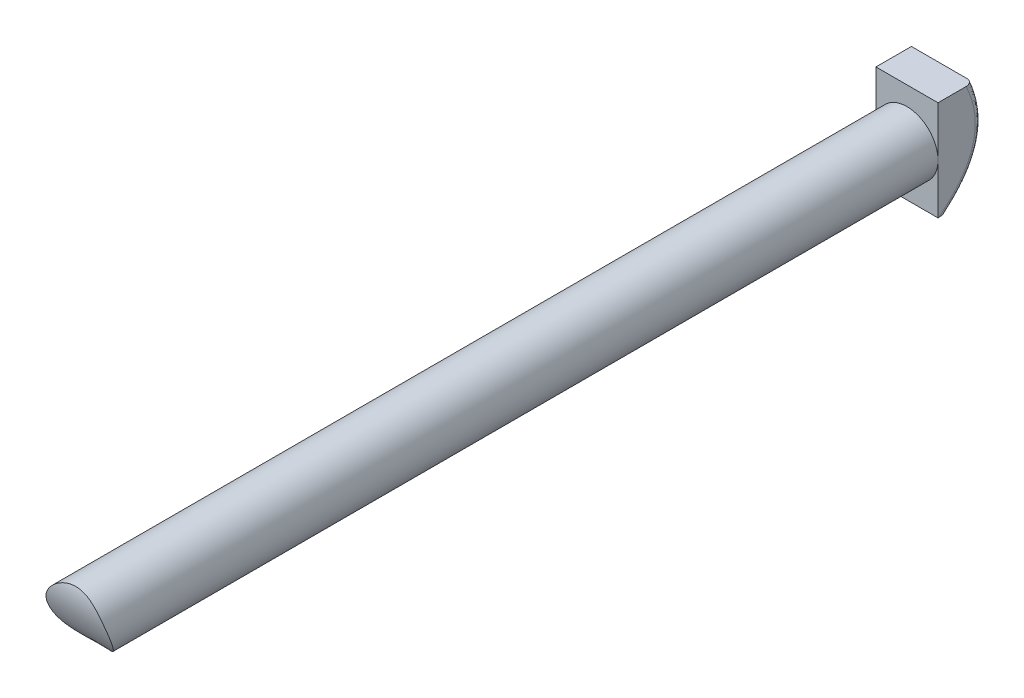
ISO-10303-21;
HEADER;
FILE_DESCRIPTION(('STEP AP214'),'2;1');
FILE_NAME('part.step','',(''),(''),'','','');
FILE_SCHEMA(('AUTOMOTIVE_DESIGN { 1 0 10303 214 1 1 1 1 }'));
ENDSEC;
DATA;
#1=APPLICATION_CONTEXT('core data for automotive mechanical design processes');
#2=APPLICATION_PROTOCOL_DEFINITION('international standard','automotive_design',2000,#1);
#3=PRODUCT_CONTEXT('',#1,'mechanical');
#4=PRODUCT('Part','Part','',(#3));
#5=PRODUCT_RELATED_PRODUCT_CATEGORY('part','',(#4));
#6=PRODUCT_DEFINITION_FORMATION('','',#4);
#7=PRODUCT_DEFINITION_CONTEXT('part definition',#1,'design');
#8=PRODUCT_DEFINITION('design','',#6,#7);
#9=PRODUCT_DEFINITION_SHAPE('','',#8);
#10=(LENGTH_UNIT() NAMED_UNIT(*) SI_UNIT(.MILLI.,.METRE.));
#11=(NAMED_UNIT(*) PLANE_ANGLE_UNIT() SI_UNIT($,.RADIAN.));
#12=(NAMED_UNIT(*) SI_UNIT($,.STERADIAN.) SOLID_ANGLE_UNIT());
#13=UNCERTAINTY_MEASURE_WITH_UNIT(LENGTH_MEASURE(1.E-05),#10,'distance_accuracy_value','');
#14=(GEOMETRIC_REPRESENTATION_CONTEXT(3) GLOBAL_UNCERTAINTY_ASSIGNED_CONTEXT((#13)) GLOBAL_UNIT_ASSIGNED_CONTEXT((#10,
#11,#12)) REPRESENTATION_CONTEXT('',''));
#15=CARTESIAN_POINT('',(0.,0.,0.));
#16=DIRECTION('',(0.,0.,1.));
#17=DIRECTION('',(1.,0.,0.));
#18=AXIS2_PLACEMENT_3D('',#15,#16,#17);
#19=CARTESIAN_POINT('',(0.,0.,76.));
#20=DIRECTION('',(0.,0.,-1.));
#21=DIRECTION('',(-1.,0.,0.));
#22=AXIS2_PLACEMENT_3D('',#19,#20,#21);
#23=CYLINDRICAL_SURFACE('',#22,2.8);
#24=CARTESIAN_POINT('',(-2.8,0.,74.7435755469193));
#25=CARTESIAN_POINT('',(-2.79999762647022,0.138351904805586,74.7976580439721));
#26=CARTESIAN_POINT('',(-2.7897316714088,0.278097777593786,74.8485891226111));
#27=CARTESIAN_POINT('',(-2.75812356861288,0.48759216015189,74.9172705104928));
#28=CARTESIAN_POINT('',(-2.74489030057541,0.557388843720657,74.9388748612339));
#29=CARTESIAN_POINT('',(-2.71291266237373,0.696559649470459,74.9791287525321));
#30=CARTESIAN_POINT('',(-2.69417089401994,0.765933955397322,74.9977796816834));
#31=CARTESIAN_POINT('',(-2.6509752028806,0.904219763511875,75.0319117916057));
#32=CARTESIAN_POINT('',(-2.62648378111979,0.973125033132954,75.0473708546985));
#33=CARTESIAN_POINT('',(-2.57188866284434,1.1094032221047,75.0747504653819));
#34=CARTESIAN_POINT('',(-2.54178503057522,1.17677615898676,75.0866710534749));
#35=CARTESIAN_POINT('',(-2.47609955115154,1.30935222155061,75.1069172374877));
#36=CARTESIAN_POINT('',(-2.44051805665511,1.37455548658483,75.1152430647025));
#37=CARTESIAN_POINT('',(-2.36410741018287,1.50217427538379,75.1284166079698));
#38=CARTESIAN_POINT('',(-2.32327845026488,1.56458990106383,75.1332644512742));
#39=CARTESIAN_POINT('',(-2.24005375821403,1.68133569460541,75.1395078287622));
#40=CARTESIAN_POINT('',(-2.19802742881146,1.73591704180964,75.1411427376584));
#41=CARTESIAN_POINT('',(-2.11005369758693,1.84185279612521,75.1420161470909));
#42=CARTESIAN_POINT('',(-2.06410495150746,1.89320608638997,75.141253822834));
#43=CARTESIAN_POINT('',(-1.92080854936321,2.0419131284115,75.1359423672282));
#44=CARTESIAN_POINT('',(-1.81797129444004,2.13396928055858,75.1283709589539));
#45=CARTESIAN_POINT('',(-1.59353528080983,2.30694282579109,75.1081470974128));
#46=CARTESIAN_POINT('',(-1.47117027617807,2.38682194899047,75.0952098638402));
#47=CARTESIAN_POINT('',(-1.21547699860971,2.52662148741134,75.0686333611557));
#48=CARTESIAN_POINT('',(-1.08214573380327,2.58653643323486,75.054993900841));
#49=CARTESIAN_POINT('',(-0.870660170929278,2.66236680432226,75.0363118377686));
#50=CARTESIAN_POINT('',(-0.795234183980504,2.68586092168323,75.0301947628218));
#51=CARTESIAN_POINT('',(-0.64258263970425,2.72641057810066,75.0193037641352));
#52=CARTESIAN_POINT('',(-0.56535770582049,2.74346831351811,75.0145293823544));
#53=CARTESIAN_POINT('',(-0.409669205803472,2.77099653097655,75.0066859556104));
#54=CARTESIAN_POINT('',(-0.331205790087291,2.78146780674629,75.0036167051683));
#55=CARTESIAN_POINT('',(-0.173623018218384,2.79573112053131,74.9994098513152));
#56=CARTESIAN_POINT('',(-0.094503691771523,2.7995234593898,74.9982721608999));
#57=CARTESIAN_POINT('',(0.0613720108072199,2.80037904200705,74.9980165205912));
#58=CARTESIAN_POINT('',(0.138127265133801,2.79764291065988,74.9988383525225));
#59=CARTESIAN_POINT('',(0.291137606856789,2.78588032031138,75.0023196045069));
#60=CARTESIAN_POINT('',(0.367392511173531,2.77685167571773,75.0049796630325));
#61=CARTESIAN_POINT('',(0.518819643476405,2.75258120819291,75.0119531195065));
#62=CARTESIAN_POINT('',(0.593992047377822,2.73734040685978,75.0162662455985));
#63=CARTESIAN_POINT('',(0.742760164314515,2.70077448064792,75.0262371195217));
#64=CARTESIAN_POINT('',(0.816355293726873,2.67944714403512,75.0318953560159));
#65=CARTESIAN_POINT('',(1.03331773922512,2.60680054142298,75.0502430212239));
#66=CARTESIAN_POINT('',(1.17371391785876,2.54667850747374,75.0643523592354));
#67=CARTESIAN_POINT('',(1.44297499805961,2.40437583716829,75.0922290561966));
#68=CARTESIAN_POINT('',(1.57183432588937,2.3221846145085,75.1059962475512));
#69=CARTESIAN_POINT('',(1.75629627490273,2.18213375220507,75.1228958616605));
#70=CARTESIAN_POINT('',(1.81735251064006,2.1315538853755,75.1279599665008));
#71=CARTESIAN_POINT('',(1.93502147098147,2.02533070645249,75.1359632209438));
#72=CARTESIAN_POINT('',(1.99163624585374,1.96968975657938,75.1389033562205));
#73=CARTESIAN_POINT('',(2.09992595224729,1.85380586665543,75.1419991838089));
#74=CARTESIAN_POINT('',(2.1516050193779,1.79356685682435,75.1421572279462));
#75=CARTESIAN_POINT('',(2.24962618161096,1.66897035107457,75.1391233514823));
#76=CARTESIAN_POINT('',(2.2959688984799,1.60461333632861,75.1359318215968));
#77=CARTESIAN_POINT('',(2.37961824456882,1.47741854045748,75.1261573693158));
#78=CARTESIAN_POINT('',(2.41734331369772,1.41483444698495,75.1198494155563));
#79=CARTESIAN_POINT('',(2.48762681406989,1.28725142244785,75.10381437975));
#80=CARTESIAN_POINT('',(2.52018551743489,1.2222526187931,75.0940874778721));
#81=CARTESIAN_POINT('',(2.57995928906817,1.09043476879734,75.0711765238144));
#82=CARTESIAN_POINT('',(2.6071742768675,1.02361569506283,75.0579924195809));
#83=CARTESIAN_POINT('',(2.65617729823388,0.888746769763792,75.0282851221439));
#84=CARTESIAN_POINT('',(2.67796533211666,0.820696918270864,75.0117619291347));
#85=CARTESIAN_POINT('',(2.7149858122674,0.687976603334097,74.9767047536988));
#86=CARTESIAN_POINT('',(2.73053114514203,0.623345937204844,74.9583488735818));
#87=CARTESIAN_POINT('',(2.75689713989962,0.493851816238371,74.9191989656401));
#88=CARTESIAN_POINT('',(2.76771593283514,0.428988279522988,74.8984039774693));
#89=CARTESIAN_POINT('',(2.79322165754405,0.234511657267058,74.8328728780014));
#90=CARTESIAN_POINT('',(2.80096863232795,0.104973452685037,74.7849800108818));
#91=CARTESIAN_POINT('',(2.79929631210529,-0.0963390504018077,74.7056498371672));
#92=CARTESIAN_POINT('',(2.79583162690781,-0.168971931037816,74.6760050685715));
#93=CARTESIAN_POINT('',(2.78338626293074,-0.313031946274304,74.6149700867135));
#94=CARTESIAN_POINT('',(2.77440547753804,-0.384459057542706,74.583579839726));
#95=CARTESIAN_POINT('',(2.73951523105016,-0.596237222119587,74.4869370810656));
#96=CARTESIAN_POINT('',(2.70565628265857,-0.734200815673466,74.4191672997878));
#97=CARTESIAN_POINT('',(2.61260104803446,-1.01980792380719,74.2680358820652));
#98=CARTESIAN_POINT('',(2.55048695883073,-1.16603914301534,74.1838273262357));
#99=CARTESIAN_POINT('',(2.40405326158826,-1.44404348048602,74.0104774004434));
#100=CARTESIAN_POINT('',(2.31970134234928,-1.57579516230144,73.9213290030604));
#101=CARTESIAN_POINT('',(2.17276981253542,-1.7682170871929,73.7814368054765));
#102=CARTESIAN_POINT('',(2.11704142069412,-1.83456987296545,73.7311309265874));
#103=CARTESIAN_POINT('',(1.99952918271772,-1.961987313066,73.6308079170243));
#104=CARTESIAN_POINT('',(1.937744020425,-2.02305081255907,73.580790851622));
#105=CARTESIAN_POINT('',(1.80827792156313,-2.13955889898021,73.4819586025935));
#106=CARTESIAN_POINT('',(1.74060039291702,-2.19500669419942,73.433142744916));
#107=CARTESIAN_POINT('',(1.59935936177295,-2.29995368811041,73.3377676931295));
#108=CARTESIAN_POINT('',(1.52579838408953,-2.34945541591329,73.2912075446372));
#109=CARTESIAN_POINT('',(1.34420884293528,-2.45930422388734,73.184929474062));
#110=CARTESIAN_POINT('',(1.23352952539254,-2.51684640369195,73.1267510490166));
#111=CARTESIAN_POINT('',(1.00116555867335,-2.61795038361666,73.0214520759772));
#112=CARTESIAN_POINT('',(0.879503679721958,-2.66154029474242,72.9743093454624));
#113=CARTESIAN_POINT('',(0.651351132554299,-2.72521926169455,72.9041235512128));
#114=CARTESIAN_POINT('',(0.546618804535992,-2.748251187277,72.8781581568218));
#115=CARTESIAN_POINT('',(0.386365222193072,-2.77374487083741,72.849187412014));
#116=CARTESIAN_POINT('',(0.332421186055586,-2.78073374571893,72.8411933705098));
#117=CARTESIAN_POINT('',(0.223820338089487,-2.79157236317292,72.8287628132514));
#118=CARTESIAN_POINT('',(0.169163815195323,-2.79542334034496,72.8243248983579));
#119=CARTESIAN_POINT('',(0.0593285816208233,-2.79991322502041,72.819148580433));
#120=CARTESIAN_POINT('',(0.00414866266977717,-2.80053944129147,72.8184247946096));
#121=CARTESIAN_POINT('',(-0.106068473134384,-2.79853301334567,72.8207398916914));
#122=CARTESIAN_POINT('',(-0.161105699250397,-2.79590058625504,72.8237785239033));
#123=CARTESIAN_POINT('',(-0.270628867760436,-2.78743222350126,72.8335151085323));
#124=CARTESIAN_POINT('',(-0.3251145491129,-2.78159483710423,72.8402147180947));
#125=CARTESIAN_POINT('',(-0.433145986585545,-2.76683205366004,72.8570564172083));
#126=CARTESIAN_POINT('',(-0.486691264985054,-2.75790513224644,72.8672002060595));
#127=CARTESIAN_POINT('',(-0.602228983971156,-2.73521330462686,72.8927812040978));
#128=CARTESIAN_POINT('',(-0.66396724570602,-2.72086104465569,72.9088483657738));
#129=CARTESIAN_POINT('',(-0.785307302521116,-2.68835362040309,72.9448040464695));
#130=CARTESIAN_POINT('',(-0.844907606240367,-2.67019585971961,72.964695173719));
#131=CARTESIAN_POINT('',(-1.02035391601718,-2.61039335420395,73.0292728535915));
#132=CARTESIAN_POINT('',(-1.13266505618912,-2.56345616805731,73.0788207446817));
#133=CARTESIAN_POINT('',(-1.31523280421796,-2.47331098360127,73.1704302692488));
#134=CARTESIAN_POINT('',(-1.38811875532467,-2.43309042036736,73.2103858689616));
#135=CARTESIAN_POINT('',(-1.52873912098998,-2.34727987579869,73.2932043714634));
#136=CARTESIAN_POINT('',(-1.59648094748799,-2.301697870731,73.3360629162107));
#137=CARTESIAN_POINT('',(-1.72704567054853,-2.20542658382064,73.4237787833247));
#138=CARTESIAN_POINT('',(-1.78986007932137,-2.15472881884133,73.4686393544894));
#139=CARTESIAN_POINT('',(-1.91046300930439,-2.04855668657919,73.5594606741041));
#140=CARTESIAN_POINT('',(-1.96825098855267,-1.99308180549616,73.6054215405109));
#141=CARTESIAN_POINT('',(-2.08028846034701,-1.87594047681886,73.6990433926052));
#142=CARTESIAN_POINT('',(-2.13439183615343,-1.81414337368624,73.7467157222632));
#143=CARTESIAN_POINT('',(-2.23703997902934,-1.68594003752575,73.8418289401708));
#144=CARTESIAN_POINT('',(-2.28558530044572,-1.61953426521833,73.8892698510489));
#145=CARTESIAN_POINT('',(-2.3768603459147,-1.48233623428108,73.9833624847523));
#146=CARTESIAN_POINT('',(-2.41959141472925,-1.41154499548442,74.0300143878718));
#147=CARTESIAN_POINT('',(-2.49891208223511,-1.26582747597063,74.1220588931156));
#148=CARTESIAN_POINT('',(-2.53550202621437,-1.19090142805029,74.1674515659211));
#149=CARTESIAN_POINT('',(-2.60582073331005,-1.02875732655388,74.2614896128176));
#150=CARTESIAN_POINT('',(-2.63878920560936,-0.941094845975254,74.309941789222));
#151=CARTESIAN_POINT('',(-2.69606069334888,-0.761660731240091,74.4043322192778));
#152=CARTESIAN_POINT('',(-2.72036272341907,-0.669888631156296,74.4502701865626));
#153=CARTESIAN_POINT('',(-2.75967043584837,-0.483036595949784,74.539262155359));
#154=CARTESIAN_POINT('',(-2.77467973955648,-0.387957964648111,74.5823172744673));
#155=CARTESIAN_POINT('',(-2.79484386147682,-0.195485995162707,74.6653008846971));
#156=CARTESIAN_POINT('',(-2.80000168286471,-0.0980933715571365,74.7052303251054));
#157=CARTESIAN_POINT('',(-2.8,0.,74.7435755469193));
#158=B_SPLINE_CURVE_WITH_KNOTS('',3,(#24,#25,#26,#27,#28,#29,#30,#31,#32,#33,#34,#35,#36,#37,
#38,#39,#40,#41,#42,#43,#44,#45,#46,#47,#48,#49,#50,#51,#52,#53,#54,#55,#56,#57,#58,#59,#60,#61,
#62,#63,#64,#65,#66,#67,#68,#69,#70,#71,#72,#73,#74,#75,#76,#77,#78,#79,#80,#81,#82,#83,#84,#85,
#86,#87,#88,#89,#90,#91,#92,#93,#94,#95,#96,#97,#98,#99,#100,#101,#102,#103,#104,#105,#106,#107,
#108,#109,#110,#111,#112,#113,#114,#115,#116,#117,#118,#119,#120,#121,#122,#123,#124,#125,#126,
#127,#128,#129,#130,#131,#132,#133,#134,#135,#136,#137,#138,#139,#140,#141,#142,#143,#144,#145,
#146,#147,#148,#149,#150,#151,#152,#153,#154,#155,#156,#157),.UNSPECIFIED.,.T.,.F.,(4,2,2,2,2,2,
2,2,2,2,2,2,2,2,2,2,2,2,2,2,2,2,2,2,2,2,2,2,2,2,2,2,2,2,2,2,2,2,2,2,2,2,2,2,2,2,2,2,2,2,2,2,2,2,
2,2,2,2,2,2,2,2,2,2,2,2,4),(0.,0.445269468487311,0.667814611605466,0.890254809223312,
1.11418816106039,1.33811894958875,1.56203532774861,1.78594351287628,1.99242099398792,
2.1989695236086,2.61186523629307,3.050246905415,3.48874857528581,3.72621192470441,
3.96359416831936,4.20094779971479,4.43829073957981,4.66843433600619,4.89865790857169,
5.12884363580739,5.35911311500672,5.81709142609501,6.27528981712177,6.51336774702867,
6.75133512062953,6.98910132012924,7.22683978813473,7.44658444887243,7.66631753142104,
7.88605392259231,8.10579030097946,8.31245434815612,8.51920003971342,8.93256691742259,
9.1679683490191,9.40337433050993,9.87381729698071,10.4111419773383,10.9492517261629,
11.2495653789543,11.5499444362375,11.8501509051873,12.1502292281929,12.5618109883698,
12.9725581968364,13.3020695269691,13.4668271325844,13.6315198833069,13.7968602991776,
13.9621896988653,14.1275939971442,14.2930800219804,14.4889510838198,14.6849562214025,
15.0775262226807,15.3542416113571,15.6305504144882,15.9073251768523,16.1841297448488,
16.4687555093985,16.7533528612887,17.0378842771713,17.3223996897631,17.6382853363746,
17.9542068875788,18.2700052474349,18.5857073223488),.UNSPECIFIED.);
#159=CARTESIAN_POINT('',(-2.8,0.,74.7435755469193));
#160=VERTEX_POINT('',#159);
#161=EDGE_CURVE('E49',#160,#160,#158,.T.);
#162=ORIENTED_EDGE('',*,*,#161,.T.);
#163=EDGE_LOOP('',(#162));
#164=FACE_BOUND('',#163,.T.);
#165=CARTESIAN_POINT('',(0.,0.,0.));
#166=DIRECTION('',(0.,0.,1.));
#167=DIRECTION('',(1.,0.,0.));
#168=AXIS2_PLACEMENT_3D('',#165,#166,#167);
#169=CIRCLE('',#168,2.8);
#170=CARTESIAN_POINT('',(2.8,0.,0.));
#171=VERTEX_POINT('',#170);
#172=CARTESIAN_POINT('',(-2.8,0.,0.));
#173=VERTEX_POINT('',#172);
#174=EDGE_CURVE('E123',#171,#173,#169,.T.);
#175=ORIENTED_EDGE('',*,*,#174,.T.);
#176=EDGE_CURVE('E119',#173,#171,#169,.T.);
#177=ORIENTED_EDGE('',*,*,#176,.T.);
#178=EDGE_LOOP('',(#175,#177));
#179=FACE_BOUND('',#178,.T.);
#180=ADVANCED_FACE('F44',(#164,#179),#23,.T.);
#181=CARTESIAN_POINT('',(0.,0.,0.));
#182=DIRECTION('',(0.,0.,-1.));
#183=DIRECTION('',(-1.,0.,0.));
#184=AXIS2_PLACEMENT_3D('',#181,#182,#183);
#185=PLANE('',#184);
#186=ORIENTED_EDGE('',*,*,#174,.F.);
#187=DIRECTION('',(0.,-1.,0.));
#188=VECTOR('',#187,1.);
#189=CARTESIAN_POINT('',(2.8,4.5,0.));
#190=LINE('',#189,#188);
#191=CARTESIAN_POINT('',(2.8,4.5,0.));
#192=VERTEX_POINT('',#191);
#193=EDGE_CURVE('E195',#192,#171,#190,.T.);
#194=ORIENTED_EDGE('',*,*,#193,.F.);
#195=DIRECTION('',(1.,0.,0.));
#196=VECTOR('',#195,1.);
#197=CARTESIAN_POINT('',(2.8,4.5,0.));
#198=LINE('',#197,#196);
#199=CARTESIAN_POINT('',(-2.8,4.5,0.));
#200=VERTEX_POINT('',#199);
#201=EDGE_CURVE('E196',#200,#192,#198,.T.);
#202=ORIENTED_EDGE('',*,*,#201,.F.);
#203=DIRECTION('',(0.,1.,0.));
#204=VECTOR('',#203,1.);
#205=CARTESIAN_POINT('',(-2.8,4.5,0.));
#206=LINE('',#205,#204);
#207=EDGE_CURVE('E117',#173,#200,#206,.T.);
#208=ORIENTED_EDGE('',*,*,#207,.F.);
#209=EDGE_LOOP('',(#186,#194,#202,#208));
#210=FACE_BOUND('',#209,.T.);
#211=ADVANCED_FACE('F180',(#210),#185,.F.);
#212=CARTESIAN_POINT('',(-2.8,4.5,-5.));
#213=DIRECTION('',(1.,0.,0.));
#214=DIRECTION('',(0.,0.,-1.));
#215=AXIS2_PLACEMENT_3D('',#212,#213,#214);
#216=PLANE('',#215);
#217=DIRECTION('',(0.,0.,1.));
#218=VECTOR('',#217,1.);
#219=CARTESIAN_POINT('',(-2.8,4.5,-5.));
#220=LINE('',#219,#218);
#221=CARTESIAN_POINT('',(-2.8,4.5,-3.2));
#222=VERTEX_POINT('',#221);
#223=EDGE_CURVE('E104',#222,#200,#220,.T.);
#224=ORIENTED_EDGE('',*,*,#223,.F.);
#225=CARTESIAN_POINT('',(-2.8,-4.5,-1.));
#226=CARTESIAN_POINT('',(-2.8,-0.643647491511155,-5.46189929629432));
#227=CARTESIAN_POINT('',(-2.8,4.5,-3.2));
#228=B_SPLINE_CURVE_WITH_KNOTS('',2,(#225,#226,#227),.UNSPECIFIED.,.F.,.F.,(3,3),(0.,1.),.UNSPECIFIED.);
#229=CARTESIAN_POINT('',(-2.8,-4.5,-1.));
#230=VERTEX_POINT('',#229);
#231=EDGE_CURVE('E107',#230,#222,#228,.T.);
#232=ORIENTED_EDGE('',*,*,#231,.F.);
#233=DIRECTION('',(0.,0.,1.));
#234=VECTOR('',#233,1.);
#235=CARTESIAN_POINT('',(-2.8,-4.5,-5.));
#236=LINE('',#235,#234);
#237=CARTESIAN_POINT('',(-2.8,-4.5,0.));
#238=VERTEX_POINT('',#237);
#239=EDGE_CURVE('E200',#230,#238,#236,.T.);
#240=ORIENTED_EDGE('',*,*,#239,.T.);
#241=EDGE_CURVE('E197',#238,#173,#206,.T.);
#242=ORIENTED_EDGE('',*,*,#241,.T.);
#243=ORIENTED_EDGE('',*,*,#207,.T.);
#244=EDGE_LOOP('',(#224,#232,#240,#242,#243));
#245=FACE_BOUND('',#244,.T.);
#246=ADVANCED_FACE('F114',(#245),#216,.F.);
#247=CARTESIAN_POINT('',(2.8,4.5,-5.));
#248=DIRECTION('',(0.,-1.,0.));
#249=DIRECTION('',(0.,0.,-1.));
#250=AXIS2_PLACEMENT_3D('',#247,#248,#249);
#251=PLANE('',#250);
#252=DIRECTION('',(0.,0.,1.));
#253=VECTOR('',#252,1.);
#254=CARTESIAN_POINT('',(2.8,4.5,-5.));
#255=LINE('',#254,#253);
#256=CARTESIAN_POINT('',(2.8,4.5,-2.54454930727492));
#257=VERTEX_POINT('',#256);
#258=EDGE_CURVE('E120',#257,#192,#255,.T.);
#259=ORIENTED_EDGE('',*,*,#258,.F.);
#260=CARTESIAN_POINT('',(2.2,-7.38489451629639,2.33789734828735));
#261=CARTESIAN_POINT('',(2.8,-7.38489451629639,2.33789734828735));
#262=CARTESIAN_POINT('',(2.8,-6.9309463922384,2.73023788999091));
#263=CARTESIAN_POINT('',(2.2,-6.42326301199868,1.22526490017079));
#264=CARTESIAN_POINT('',(2.8,-6.42326301187679,1.22526490027614));
#265=CARTESIAN_POINT('',(2.8,-5.96931488781881,1.61760544197969));
#266=CARTESIAN_POINT('',(2.2,-5.46163150770098,0.112632452054234));
#267=CARTESIAN_POINT('',(2.8,-5.4616315074572,0.112632452264925));
#268=CARTESIAN_POINT('',(2.8,-5.00768338339922,0.504972993968477));
#269=CARTESIAN_POINT('',(2.2,-4.50000000340327,-0.999999996062326));
#270=CARTESIAN_POINT('',(2.8,-4.50000000303761,-0.99999999574629));
#271=CARTESIAN_POINT('',(2.8,-4.04605187897963,-0.607659454042737));
#272=CARTESIAN_POINT('',(2.2,-4.49125812689096,-1.01011434313046));
#273=CARTESIAN_POINT('',(2.8,-4.49125812665358,-1.01011434292529));
#274=CARTESIAN_POINT('',(2.8,-4.03771500185208,-0.617305295409156));
#275=CARTESIAN_POINT('',(2.2,-4.48249863943169,-1.02021765443327));
#276=CARTESIAN_POINT('',(2.8,-4.48249863931611,-1.02021765433338));
#277=CARTESIAN_POINT('',(2.8,-4.02936278514566,-0.626938845932322));
#278=CARTESIAN_POINT('',(2.20000000000004,-4.17769349985859,-1.3706845218938));
#279=CARTESIAN_POINT('',(2.80000000000004,-4.17769350375672,-1.37068452526288));
#280=CARTESIAN_POINT('',(2.8,-3.73878099384663,-0.961049061772282));
#281=CARTESIAN_POINT('',(2.20000000000001,-3.86153287650576,-1.6982655547709));
#282=CARTESIAN_POINT('',(2.80000000000001,-3.86153287721946,-1.69826555538774));
#283=CARTESIAN_POINT('',(2.8,-3.43905678753477,-1.27132676890722));
#284=CARTESIAN_POINT('',(2.2,-3.35173978985599,-2.15854272933027));
#285=CARTESIAN_POINT('',(2.8,-3.35173978949852,-2.15854272902132));
#286=CARTESIAN_POINT('',(2.8,-2.95983992861435,-1.70401163221689));
#287=CARTESIAN_POINT('',(2.2,-3.17571774341157,-2.30689950290436));
#288=CARTESIAN_POINT('',(2.8,-3.17571774331644,-2.30689950282214));
#289=CARTESIAN_POINT('',(2.8,-2.79500899373038,-1.8428892794049));
#290=CARTESIAN_POINT('',(2.2,-2.81089956769487,-2.59061329517096));
#291=CARTESIAN_POINT('',(2.8,-2.81089956778998,-2.59061329525317));
#292=CARTESIAN_POINT('',(2.8,-2.4549297984959,-2.10736180222055));
#293=CARTESIAN_POINT('',(2.2,-2.62210593829027,-2.7259728454199));
#294=CARTESIAN_POINT('',(2.8,-2.62210593831336,-2.72597284543986));
#295=CARTESIAN_POINT('',(2.8,-2.27968357761019,-2.23295926500306));
#296=CARTESIAN_POINT('',(2.2,-2.26713664064274,-2.95727479239354));
#297=CARTESIAN_POINT('',(2.8,-2.26713664062387,-2.95727479237723));
#298=CARTESIAN_POINT('',(2.8,-1.95171690915008,-2.44666761278576));
#299=CARTESIAN_POINT('',(2.2,-2.10312743209964,-3.05590115460503));
#300=CARTESIAN_POINT('',(2.8,-2.10312743209458,-3.05590115460066));
#301=CARTESIAN_POINT('',(2.8,-1.8007278792464,-2.53743549148995));
#302=CARTESIAN_POINT('',(2.2,-1.76664969471374,-3.24040627511066));
#303=CARTESIAN_POINT('',(2.8,-1.7666496947188,-3.24040627511503));
#304=CARTESIAN_POINT('',(2.8,-1.4920703353243,-2.70668595883046));
#305=CARTESIAN_POINT('',(2.2,-1.59418550224131,-3.32629147891297));
#306=CARTESIAN_POINT('',(2.8,-1.59418550224266,-3.32629147891413));
#307=CARTESIAN_POINT('',(2.8,-1.33440525084313,-2.78517476032073));
#308=CARTESIAN_POINT('',(2.2,-1.24198449093502,-3.48318884148108));
#309=CARTESIAN_POINT('',(2.8,-1.24198449093367,-3.48318884147992));
#310=CARTESIAN_POINT('',(2.8,-1.0133989189682,-2.92817653977383));
#311=CARTESIAN_POINT('',(2.2,-1.06227105172849,-3.55424486295543));
#312=CARTESIAN_POINT('',(2.8,-1.06227105172813,-3.55424486295512));
#313=CARTESIAN_POINT('',(2.8,-0.850076126677991,-2.99273075436581));
#314=CARTESIAN_POINT('',(2.2,-0.696409235671112,-3.68009387122748));
#315=CARTESIAN_POINT('',(2.8,-0.696409235671473,-3.68009387122779));
#316=CARTESIAN_POINT('',(2.8,-0.518266072416322,-3.10686740291308));
#317=CARTESIAN_POINT('',(2.2,-0.510261151482525,-3.73488759658759));
#318=CARTESIAN_POINT('',(2.8,-0.510261151482622,-3.73488759658767));
#319=CARTESIAN_POINT('',(2.8,-0.34977904536538,-3.15645051679209));
#320=CARTESIAN_POINT('',(2.2,-0.134721259990373,-3.82668538895189));
#321=CARTESIAN_POINT('',(2.8,-0.134721259990276,-3.82668538895181));
#322=CARTESIAN_POINT('',(2.8,-0.0101320760774247,-3.23947484624119));
#323=CARTESIAN_POINT('',(2.2,0.0546382261758217,-3.86381273142827));
#324=CARTESIAN_POINT('',(2.8,0.0546382261758492,-3.86381273142825));
#325=CARTESIAN_POINT('',(2.8,0.161000475068194,-3.27302792573511));
#326=CARTESIAN_POINT('',(2.2,0.435736074341333,-3.92040321536134));
#327=CARTESIAN_POINT('',(2.8,0.435736074341306,-3.92040321536136));
#328=CARTESIAN_POINT('',(2.8,0.505629619976561,-3.32420280846453));
#329=CARTESIAN_POINT('',(2.2,0.627474504927884,-3.93986584632238));
#330=CARTESIAN_POINT('',(2.8,0.627474504927871,-3.93986584632237));
#331=CARTESIAN_POINT('',(2.8,0.679126281913109,-3.34182415128586));
#332=CARTESIAN_POINT('',(2.2,1.01222470765613,-3.96152978348305));
#333=CARTESIAN_POINT('',(2.8,1.01222470765614,-3.96152978348306));
#334=CARTESIAN_POINT('',(2.8,1.02792986695371,-3.36146336216405));
#335=CARTESIAN_POINT('',(2.2,1.20523773611099,-3.96363668883781));
#336=CARTESIAN_POINT('',(2.8,1.20523773611101,-3.96363668883787));
#337=CARTESIAN_POINT('',(2.8,1.20324150382418,-3.36339589520212));
#338=CARTESIAN_POINT('',(2.2,1.58959813285992,-3.9513845585744));
#339=CARTESIAN_POINT('',(2.8,1.58959813285989,-3.95138455857435));
#340=CARTESIAN_POINT('',(2.8,1.5533498718642,-3.3522349409108));
#341=CARTESIAN_POINT('',(2.2,1.78094552432098,-3.93702575234425));
#342=CARTESIAN_POINT('',(2.8,1.78094552432089,-3.93702575234405));
#343=CARTESIAN_POINT('',(2.8,1.72814661017293,-3.33914166290979));
#344=CARTESIAN_POINT('',(2.2,2.19394750075581,-3.88947983992271));
#345=CARTESIAN_POINT('',(2.8,2.19394750075592,-3.88947983992295));
#346=CARTESIAN_POINT('',(2.8,2.10672096309821,-3.29555819239771));
#347=CARTESIAN_POINT('',(2.2,2.41501637056371,-3.85342648438719));
#348=CARTESIAN_POINT('',(2.8,2.41501637056413,-3.85342648438815));
#349=CARTESIAN_POINT('',(2.8,2.31019120526462,-3.26241427631009));
#350=CARTESIAN_POINT('',(2.2,2.85156240983595,-3.76328928766954));
#351=CARTESIAN_POINT('',(2.8,2.85156240983553,-3.76328928766858));
#352=CARTESIAN_POINT('',(2.8,2.71370873218577,-3.17909641580112));
#353=CARTESIAN_POINT('',(2.2,3.06703523697721,-3.7091918704817));
#354=CARTESIAN_POINT('',(2.8,3.06703523697562,-3.70919187047809));
#355=CARTESIAN_POINT('',(2.8,2.91375332003989,-3.12890964814883));
#356=CARTESIAN_POINT('',(2.2,3.48934135928801,-3.58629591531888));
#357=CARTESIAN_POINT('',(2.8,3.48934135928958,-3.58629591532245));
#358=CARTESIAN_POINT('',(2.8,3.30744689733882,-3.01433823720688));
#359=CARTESIAN_POINT('',(2.2,3.69624059180541,-3.51765382331964));
#360=CARTESIAN_POINT('',(2.8,3.69624059181125,-3.51765382333292));
#361=CARTESIAN_POINT('',(2.8,3.50114043549096,-2.95010446796753));
#362=CARTESIAN_POINT('',(2.2,4.10317104440077,-3.36774162481444));
#363=CARTESIAN_POINT('',(2.8,4.10317104439494,-3.36774162480119));
#364=CARTESIAN_POINT('',(2.8,3.88352453790484,-2.80924247902155));
#365=CARTESIAN_POINT('',(2.2,4.30321578370306,-3.28649835884996));
#366=CARTESIAN_POINT('',(2.8,4.30321578368133,-3.28649835880056));
#367=CARTESIAN_POINT('',(2.8,4.07222476038533,-2.73264058956041));
#368=CARTESIAN_POINT('',(2.2,4.49999998074133,-3.20000000846892));
#369=CARTESIAN_POINT('',(2.8,4.49999998068092,-3.20000000833153));
#370=CARTESIAN_POINT('',(2.8,4.25847362782663,-2.65075960479506));
#371=CARTESIAN_POINT('',(2.2,4.56424958405446,-3.17174649133717));
#372=CARTESIAN_POINT('',(2.8,4.56424958401453,-3.17174649124638));
#373=CARTESIAN_POINT('',(2.8,4.32272322766433,-2.62250608924722));
#374=CARTESIAN_POINT('',(2.2,4.62849918730707,-3.14349297423202));
#375=CARTESIAN_POINT('',(2.8,4.62849918728728,-3.14349297418703));
#376=CARTESIAN_POINT('',(2.8,4.38697282750167,-2.59425257369858));
#377=CARTESIAN_POINT('',(2.2,8.27625012895433,-1.53940845996746));
#378=CARTESIAN_POINT('',(2.8,8.27625013005779,-1.53940846247677));
#379=CARTESIAN_POINT('',(2.8,8.03472357866347,-0.990168146247523));
#380=CARTESIAN_POINT('',(2.2,11.8597512791757,0.0364224544434752));
#381=CARTESIAN_POINT('',(2.8,11.8597512802791,0.0364224519341705));
#382=CARTESIAN_POINT('',(2.8,11.6182247288848,0.585662768163414));
#383=CARTESIAN_POINT('',(2.2,15.4432522411632,1.61225328607934));
#384=CARTESIAN_POINT('',(2.8,15.4432522411632,1.61225328607934));
#385=CARTESIAN_POINT('',(2.8,15.2017258780027,2.16149368508369));
#386=(BOUNDED_SURFACE() B_SPLINE_SURFACE(3,2,((#260,#261,#262),(#263,#264,#265),(#266,#267,
#268),(#269,#270,#271),(#272,#273,#274),(#275,#276,#277),(#278,#279,#280),(#281,#282,#283),
(#284,#285,#286),(#287,#288,#289),(#290,#291,#292),(#293,#294,#295),(#296,#297,#298),(#299,#300,
#301),(#302,#303,#304),(#305,#306,#307),(#308,#309,#310),(#311,#312,#313),(#314,#315,#316),
(#317,#318,#319),(#320,#321,#322),(#323,#324,#325),(#326,#327,#328),(#329,#330,#331),(#332,#333,
#334),(#335,#336,#337),(#338,#339,#340),(#341,#342,#343),(#344,#345,#346),(#347,#348,#349),
(#350,#351,#352),(#353,#354,#355),(#356,#357,#358),(#359,#360,#361),(#362,#363,#364),(#365,#366,
#367),(#368,#369,#370),(#371,#372,#373),(#374,#375,#376),(#377,#378,#379),(#380,#381,#382),
(#383,#384,#385)),.UNSPECIFIED.,.F.,.F.,.F.) B_SPLINE_SURFACE_WITH_KNOTS((4,3,2,2,2,2,2,2,2,2,2,
2,2,2,2,2,2,3,2,4),(3,3),(0.,4.41182218951959,4.45007234449854,5.74013439956992,
6.38627066380748,7.03228081936513,7.56030723119284,8.08806560695079,8.61424009959426,
9.14039069203394,9.66281393319977,10.1852522714878,10.7105303800927,11.2358011710037,
11.8534146549025,12.4714938714695,13.0832348097568,13.6936901922342,13.9042524157717,
25.6482939722402),(0.,1.),
.UNSPECIFIED.) GEOMETRIC_REPRESENTATION_ITEM() RATIONAL_B_SPLINE_SURFACE(((1.,0.707106781186548,
1.),(1.,0.707106781186548,1.),(1.,0.707106781186548,1.),(1.,0.707106781186548,1.),(1.,
0.707106781186548,1.),(1.,0.707106781186548,1.),(1.,0.707106781186548,1.),(1.,0.707106781186548,
1.),(1.,0.707106781186548,1.),(1.,0.707106781186548,1.),(1.,0.707106781186548,1.),(1.,
0.707106781186548,1.),(1.,0.707106781186548,1.),(1.,0.707106781186548,1.),(1.,0.707106781186548,
1.),(1.,0.707106781186548,1.),(1.,0.707106781186548,1.),(1.,0.707106781186548,1.),(1.,
0.707106781186548,1.),(1.,0.707106781186548,1.),(1.,0.707106781186548,1.),(1.,0.707106781186548,
1.),(1.,0.707106781186548,1.),(1.,0.707106781186548,1.),(1.,0.707106781186548,1.),(1.,
0.707106781186548,1.),(1.,0.707106781186548,1.),(1.,0.707106781186548,1.),(1.,0.707106781186548,
1.),(1.,0.707106781186548,1.),(1.,0.707106781186548,1.),(1.,0.707106781186548,1.),(1.,
0.707106781186548,1.),(1.,0.707106781186548,1.),(1.,0.707106781186548,1.),(1.,0.707106781186548,
1.),(1.,0.707106781186548,1.),(1.,0.707106781186548,1.),(1.,0.707106781186548,1.),(1.,
0.707106781186548,1.),(1.,0.707106781186548,1.),(1.,0.707106781186548,1.))) REPRESENTATION_ITEM('') SURFACE());
#387=CARTESIAN_POINT('',(2.8,4.5,-2.54454930727492));
#388=CARTESIAN_POINT('',(2.80001600721693,4.5,-2.58405300132922));
#389=CARTESIAN_POINT('',(2.79673099387211,4.5,-2.6235688983755));
#390=CARTESIAN_POINT('',(2.78365173814978,4.5,-2.70159458753296));
#391=CARTESIAN_POINT('',(2.77384336974328,4.5,-2.74010200733343));
#392=CARTESIAN_POINT('',(2.7477926001199,4.5,-2.81495187535542));
#393=CARTESIAN_POINT('',(2.73154110001834,4.5,-2.85129117794183));
#394=CARTESIAN_POINT('',(2.69288227332273,4.5,-2.92050893141783));
#395=CARTESIAN_POINT('',(2.67048112348928,4.5,-2.95339080938357));
#396=CARTESIAN_POINT('',(2.62119880601627,4.5,-3.01298812096064));
#397=CARTESIAN_POINT('',(2.59458531521814,4.5,-3.03992424773233));
#398=CARTESIAN_POINT('',(2.53682239643301,4.5,-3.08843224546406));
#399=CARTESIAN_POINT('',(2.50567368573019,4.5,-3.1100049632354));
#400=CARTESIAN_POINT('',(2.44267108000366,4.5,-3.14513289897732));
#401=CARTESIAN_POINT('',(2.41111439818437,4.5,-3.15922242344534));
#402=CARTESIAN_POINT('',(2.34598360689038,4.5,-3.18138898712791));
#403=CARTESIAN_POINT('',(2.31241362469588,4.5,-3.18947790101137));
#404=CARTESIAN_POINT('',(2.26543596857753,4.5,-3.19624895563044));
#405=CARTESIAN_POINT('',(2.25237844836668,4.5,-3.19765542714352));
#406=CARTESIAN_POINT('',(2.22621626735919,4.5,-3.19952988243799));
#407=CARTESIAN_POINT('',(2.21311170907369,4.5,-3.1999992968786));
#408=CARTESIAN_POINT('',(2.2,4.5,-3.2));
#409=B_SPLINE_CURVE_WITH_KNOTS('',3,(#387,#388,#389,#390,#391,#392,#393,#394,#395,#396,#397,
#398,#399,#400,#401,#402,#403,#404,#405,#406,#407,#408),.UNSPECIFIED.,.F.,.F.,(4,2,2,2,2,2,2,2,
2,2,4),(0.,0.118396514360682,0.237050249403188,0.35587214557656,0.474575129943471,
0.587562053157382,0.700531125886349,0.80367008974428,0.906604402381485,0.94597709090835,
0.985289620758703),.UNSPECIFIED.);
#410=CARTESIAN_POINT('',(2.2,4.5,-3.2));
#411=VERTEX_POINT('',#410);
#412=EDGE_CURVE('E73',#257,#411,#409,.T.);
#413=ORIENTED_EDGE('',*,*,#412,.T.);
#414=DIRECTION('',(-1.,0.,0.));
#415=VECTOR('',#414,1.);
#416=CARTESIAN_POINT('',(7.2,4.5,-3.2));
#417=LINE('',#416,#415);
#418=EDGE_CURVE('E99',#411,#222,#417,.T.);
#419=ORIENTED_EDGE('',*,*,#418,.T.);
#420=ORIENTED_EDGE('',*,*,#223,.T.);
#421=ORIENTED_EDGE('',*,*,#201,.T.);
#422=EDGE_LOOP('',(#259,#413,#419,#420,#421));
#423=FACE_BOUND('',#422,.T.);
#424=ADVANCED_FACE('F101',(#423),#251,.F.);
#425=CARTESIAN_POINT('',(2.8,4.5,-5.));
#426=DIRECTION('',(-1.,0.,0.));
#427=DIRECTION('',(0.,0.,1.));
#428=AXIS2_PLACEMENT_3D('',#425,#426,#427);
#429=PLANE('',#428);
#430=DIRECTION('',(0.,0.,1.));
#431=VECTOR('',#430,1.);
#432=CARTESIAN_POINT('',(2.8,-4.5,-5.));
#433=LINE('',#432,#431);
#434=CARTESIAN_POINT('',(2.8,-4.5,-0.0824297727762954));
#435=VERTEX_POINT('',#434);
#436=CARTESIAN_POINT('',(2.8,-4.5,0.));
#437=VERTEX_POINT('',#436);
#438=EDGE_CURVE('E125',#435,#437,#433,.T.);
#439=ORIENTED_EDGE('',*,*,#438,.F.);
#440=CARTESIAN_POINT('',(2.8,-6.9309463922384,2.73023788999091));
#441=CARTESIAN_POINT('',(2.8,-5.96931488781881,1.61760544197969));
#442=CARTESIAN_POINT('',(2.8,-5.00768338339922,0.504972993968477));
#443=CARTESIAN_POINT('',(2.8,-4.04605187897963,-0.607659454042737));
#444=CARTESIAN_POINT('',(2.8,-4.03771500185208,-0.617305295409156));
#445=CARTESIAN_POINT('',(2.8,-4.02936278514566,-0.626938845932323));
#446=CARTESIAN_POINT('',(2.8,-3.73878099384662,-0.961049061772284));
#447=CARTESIAN_POINT('',(2.8,-3.43905678753477,-1.27132676890722));
#448=CARTESIAN_POINT('',(2.8,-2.95983992861435,-1.70401163221689));
#449=CARTESIAN_POINT('',(2.8,-2.79500899373038,-1.8428892794049));
#450=CARTESIAN_POINT('',(2.8,-2.4549297984959,-2.10736180222055));
#451=CARTESIAN_POINT('',(2.8,-2.27968357761019,-2.23295926500306));
#452=CARTESIAN_POINT('',(2.8,-1.95171690915008,-2.44666761278576));
#453=CARTESIAN_POINT('',(2.8,-1.8007278792464,-2.53743549148995));
#454=CARTESIAN_POINT('',(2.8,-1.4920703353243,-2.70668595883046));
#455=CARTESIAN_POINT('',(2.8,-1.33440525084313,-2.78517476032073));
#456=CARTESIAN_POINT('',(2.8,-1.0133989189682,-2.92817653977383));
#457=CARTESIAN_POINT('',(2.8,-0.850076126677991,-2.99273075436581));
#458=CARTESIAN_POINT('',(2.8,-0.518266072416322,-3.10686740291308));
#459=CARTESIAN_POINT('',(2.8,-0.34977904536538,-3.15645051679209));
#460=CARTESIAN_POINT('',(2.8,-0.0101320760774245,-3.23947484624119));
#461=CARTESIAN_POINT('',(2.8,0.161000475068194,-3.27302792573511));
#462=CARTESIAN_POINT('',(2.8,0.50562961997656,-3.32420280846453));
#463=CARTESIAN_POINT('',(2.8,0.67912628191311,-3.34182415128586));
#464=CARTESIAN_POINT('',(2.8,1.02792986695371,-3.36146336216405));
#465=CARTESIAN_POINT('',(2.8,1.20324150382418,-3.36339589520212));
#466=CARTESIAN_POINT('',(2.8,1.5533498718642,-3.3522349409108));
#467=CARTESIAN_POINT('',(2.8,1.72814661017293,-3.33914166290979));
#468=CARTESIAN_POINT('',(2.8,2.10672096309821,-3.29555819239771));
#469=CARTESIAN_POINT('',(2.8,2.31019120526462,-3.26241427631009));
#470=CARTESIAN_POINT('',(2.8,2.71370873218577,-3.17909641580112));
#471=CARTESIAN_POINT('',(2.8,2.91375332003989,-3.12890964814883));
#472=CARTESIAN_POINT('',(2.8,3.30744689733882,-3.01433823720688));
#473=CARTESIAN_POINT('',(2.8,3.50114043549096,-2.95010446796753));
#474=CARTESIAN_POINT('',(2.8,3.88352453790484,-2.80924247902155));
#475=CARTESIAN_POINT('',(2.8,4.07222476038533,-2.73264058956041));
#476=CARTESIAN_POINT('',(2.8,4.25847362782663,-2.65075960479506));
#477=CARTESIAN_POINT('',(2.8,4.32272322766433,-2.62250608924722));
#478=CARTESIAN_POINT('',(2.8,4.38697282750167,-2.59425257369858));
#479=CARTESIAN_POINT('',(2.8,8.03472357866348,-0.990168146247516));
#480=CARTESIAN_POINT('',(2.8,11.6182247288848,0.58566276816342));
#481=CARTESIAN_POINT('',(2.8,15.2017258780027,2.16149368508369));
#482=B_SPLINE_CURVE_WITH_KNOTS('',3,(#440,#441,#442,#443,#444,#445,#446,#447,#448,#449,#450,
#451,#452,#453,#454,#455,#456,#457,#458,#459,#460,#461,#462,#463,#464,#465,#466,#467,#468,#469,
#470,#471,#472,#473,#474,#475,#476,#477,#478,#479,#480,#481),.UNSPECIFIED.,.F.,.F.,(4,3,2,2,2,2,
2,2,2,2,2,2,2,2,2,2,2,3,2,4),(0.,4.41182218951959,4.45007234449854,5.74013439956992,
6.38627066380748,7.03228081936513,7.56030723119284,8.08806560695079,8.61424009959426,
9.14039069203394,9.66281393319977,10.1852522714878,10.7105303800927,11.2358011710037,
11.8534146549025,12.4714938714695,13.0832348097568,13.6936901922342,13.9042524157717,
25.6482939722402),.UNSPECIFIED.);
#483=EDGE_CURVE('E130',#435,#257,#482,.T.);
#484=ORIENTED_EDGE('',*,*,#483,.T.);
#485=ORIENTED_EDGE('',*,*,#258,.T.);
#486=ORIENTED_EDGE('',*,*,#193,.T.);
#487=EDGE_CURVE('E203',#171,#437,#190,.T.);
#488=ORIENTED_EDGE('',*,*,#487,.T.);
#489=EDGE_LOOP('',(#439,#484,#485,#486,#488));
#490=FACE_BOUND('',#489,.T.);
#491=ADVANCED_FACE('F144',(#490),#429,.F.);
#492=CARTESIAN_POINT('',(2.8,-4.5,-5.));
#493=DIRECTION('',(0.,1.,0.));
#494=DIRECTION('',(0.,0.,1.));
#495=AXIS2_PLACEMENT_3D('',#492,#493,#494);
#496=PLANE('',#495);
#497=DIRECTION('',(-1.,0.,0.));
#498=VECTOR('',#497,1.);
#499=CARTESIAN_POINT('',(7.2,-4.5,-1.));
#500=LINE('',#499,#498);
#501=CARTESIAN_POINT('',(2.2,-4.5,-1.));
#502=VERTEX_POINT('',#501);
#503=EDGE_CURVE('E106',#502,#230,#500,.T.);
#504=ORIENTED_EDGE('',*,*,#503,.F.);
#505=CARTESIAN_POINT('',(2.2,-4.5,-1.));
#506=CARTESIAN_POINT('',(2.21289176625447,-4.5,-1.00000317560539));
#507=CARTESIAN_POINT('',(2.22577489841633,-4.5,-0.999364009110894));
#508=CARTESIAN_POINT('',(2.25140550713027,-4.5,-0.996836364755615));
#509=CARTESIAN_POINT('',(2.26415310547201,-4.5,-0.994949125672152));
#510=CARTESIAN_POINT('',(2.30177759664797,-4.5,-0.987520835659178));
#511=CARTESIAN_POINT('',(2.32632230021356,-4.5,-0.980211475954649));
#512=CARTESIAN_POINT('',(2.37365835984183,-4.5,-0.961522803269801));
#513=CARTESIAN_POINT('',(2.39645570123939,-4.5,-0.950158214321444));
#514=CARTESIAN_POINT('',(2.44010596080111,-4.5,-0.924091624302942));
#515=CARTESIAN_POINT('',(2.46095340613578,-4.5,-0.909380605270544));
#516=CARTESIAN_POINT('',(2.50999530102618,-4.5,-0.869676059047051));
#517=CARTESIAN_POINT('',(2.53693051056426,-4.5,-0.843131072661438));
#518=CARTESIAN_POINT('',(2.58627681491774,-4.5,-0.786149327050588));
#519=CARTESIAN_POINT('',(2.60867884766119,-4.5,-0.755704967222235));
#520=CARTESIAN_POINT('',(2.65920097507708,-4.5,-0.676695497850233));
#521=CARTESIAN_POINT('',(2.68479816275369,-4.5,-0.626522129471101));
#522=CARTESIAN_POINT('',(2.72792494091783,-4.5,-0.522787514948169));
#523=CARTESIAN_POINT('',(2.74543099840573,-4.5,-0.469216895437579));
#524=CARTESIAN_POINT('',(2.77310997864245,-4.5,-0.360249865225231));
#525=CARTESIAN_POINT('',(2.78328589448031,-4.5,-0.304854209407126));
#526=CARTESIAN_POINT('',(2.79336019017179,-4.5,-0.221429476802181));
#527=CARTESIAN_POINT('',(2.7958536061849,-4.5,-0.193684417586595));
#528=CARTESIAN_POINT('',(2.79917150760375,-4.5,-0.138105240264272));
#529=CARTESIAN_POINT('',(2.79999664213091,-4.5,-0.110271161018751));
#530=CARTESIAN_POINT('',(2.8,-4.5,-0.0824297727762954));
#531=B_SPLINE_CURVE_WITH_KNOTS('',3,(#505,#506,#507,#508,#509,#510,#511,#512,#513,#514,#515,
#516,#517,#518,#519,#520,#521,#522,#523,#524,#525,#526,#527,#528,#529,#530),.UNSPECIFIED.,.F.,
.F.,(4,2,2,2,2,2,2,2,2,2,2,2,4),(0.,0.0386433154764622,0.0772483328920655,0.153614379094266,
0.229705924860352,0.306005003691549,0.418822291759594,0.531862927068708,0.6999159698032,
0.868454764656031,1.03692470162976,1.12045390661196,1.20395060446693),.UNSPECIFIED.);
#532=EDGE_CURVE('E13',#502,#435,#531,.T.);
#533=ORIENTED_EDGE('',*,*,#532,.T.);
#534=ORIENTED_EDGE('',*,*,#438,.T.);
#535=DIRECTION('',(-1.,0.,0.));
#536=VECTOR('',#535,1.);
#537=CARTESIAN_POINT('',(2.8,-4.5,0.));
#538=LINE('',#537,#536);
#539=EDGE_CURVE('E208',#437,#238,#538,.T.);
#540=ORIENTED_EDGE('',*,*,#539,.T.);
#541=ORIENTED_EDGE('',*,*,#239,.F.);
#542=EDGE_LOOP('',(#504,#533,#534,#540,#541));
#543=FACE_BOUND('',#542,.T.);
#544=ADVANCED_FACE('F173',(#543),#496,.F.);
#545=ORIENTED_EDGE('',*,*,#176,.F.);
#546=ORIENTED_EDGE('',*,*,#241,.F.);
#547=ORIENTED_EDGE('',*,*,#539,.F.);
#548=ORIENTED_EDGE('',*,*,#487,.F.);
#549=EDGE_LOOP('',(#545,#546,#547,#548));
#550=FACE_BOUND('',#549,.T.);
#551=ADVANCED_FACE('F176',(#550),#185,.F.);
#552=CARTESIAN_POINT('',(7.2,-4.5,-1.));
#553=CARTESIAN_POINT('',(7.2,-0.643647491511155,-5.46189929629432));
#554=CARTESIAN_POINT('',(7.2,4.5,-3.2));
#555=B_SPLINE_CURVE_WITH_KNOTS('',2,(#552,#553,#554),.UNSPECIFIED.,.F.,.F.,(3,3),(0.,1.),.UNSPECIFIED.);
#556=DIRECTION('',(-1.,0.,0.));
#557=VECTOR('',#556,1.);
#558=SURFACE_OF_LINEAR_EXTRUSION('',#555,#557);
#559=ORIENTED_EDGE('',*,*,#418,.F.);
#560=CARTESIAN_POINT('',(2.2,15.4432522411632,1.61225328607934));
#561=CARTESIAN_POINT('',(2.2,11.8597512791757,0.0364224544434791));
#562=CARTESIAN_POINT('',(2.2,8.27625012895434,-1.53940845996746));
#563=CARTESIAN_POINT('',(2.2,4.62849918730707,-3.14349297423202));
#564=CARTESIAN_POINT('',(2.2,4.56424958405445,-3.17174649133717));
#565=CARTESIAN_POINT('',(2.2,4.49999998074133,-3.20000000846892));
#566=CARTESIAN_POINT('',(2.2,4.30321578370306,-3.28649835884996));
#567=CARTESIAN_POINT('',(2.2,4.10317104440077,-3.36774162481444));
#568=CARTESIAN_POINT('',(2.2,3.69624059180541,-3.51765382331964));
#569=CARTESIAN_POINT('',(2.2,3.48934135928801,-3.58629591531888));
#570=CARTESIAN_POINT('',(2.2,3.06703523697721,-3.7091918704817));
#571=CARTESIAN_POINT('',(2.2,2.85156240983595,-3.76328928766954));
#572=CARTESIAN_POINT('',(2.2,2.41501637056371,-3.85342648438719));
#573=CARTESIAN_POINT('',(2.2,2.19394750075581,-3.88947983992271));
#574=CARTESIAN_POINT('',(2.2,1.78094552432098,-3.93702575234425));
#575=CARTESIAN_POINT('',(2.2,1.58959813285992,-3.9513845585744));
#576=CARTESIAN_POINT('',(2.2,1.20523773611099,-3.96363668883781));
#577=CARTESIAN_POINT('',(2.2,1.01222470765613,-3.96152978348305));
#578=CARTESIAN_POINT('',(2.2,0.627474504927885,-3.93986584632238));
#579=CARTESIAN_POINT('',(2.2,0.435736074341333,-3.92040321536134));
#580=CARTESIAN_POINT('',(2.2,0.0546382261758214,-3.86381273142827));
#581=CARTESIAN_POINT('',(2.2,-0.134721259990373,-3.82668538895189));
#582=CARTESIAN_POINT('',(2.2,-0.510261151482525,-3.73488759658759));
#583=CARTESIAN_POINT('',(2.2,-0.696409235671111,-3.68009387122748));
#584=CARTESIAN_POINT('',(2.2,-1.06227105172849,-3.55424486295543));
#585=CARTESIAN_POINT('',(2.2,-1.24198449093502,-3.48318884148108));
#586=CARTESIAN_POINT('',(2.2,-1.59418550224131,-3.32629147891296));
#587=CARTESIAN_POINT('',(2.2,-1.76664969471374,-3.24040627511067));
#588=CARTESIAN_POINT('',(2.2,-2.10312743209964,-3.05590115460503));
#589=CARTESIAN_POINT('',(2.2,-2.26713664064274,-2.95727479239354));
#590=CARTESIAN_POINT('',(2.2,-2.62210593829027,-2.7259728454199));
#591=CARTESIAN_POINT('',(2.2,-2.81089956769487,-2.59061329517096));
#592=CARTESIAN_POINT('',(2.2,-3.17571774341157,-2.30689950290436));
#593=CARTESIAN_POINT('',(2.2,-3.35173978985599,-2.15854272933027));
#594=CARTESIAN_POINT('',(2.20000000000001,-3.86153287650576,-1.6982655547709));
#595=CARTESIAN_POINT('',(2.20000000000004,-4.17769349985859,-1.3706845218938));
#596=CARTESIAN_POINT('',(2.2,-4.48249863943169,-1.02021765443327));
#597=CARTESIAN_POINT('',(2.2,-4.49125812689096,-1.01011434313046));
#598=CARTESIAN_POINT('',(2.2,-4.50000000340327,-0.999999996062326));
#599=CARTESIAN_POINT('',(2.2,-5.46163150770098,0.112632452054234));
#600=CARTESIAN_POINT('',(2.2,-6.42326301199868,1.22526490017079));
#601=CARTESIAN_POINT('',(2.2,-7.38489451629639,2.33789734828735));
#602=B_SPLINE_CURVE_WITH_KNOTS('',3,(#560,#561,#562,#563,#564,#565,#566,#567,#568,#569,#570,
#571,#572,#573,#574,#575,#576,#577,#578,#579,#580,#581,#582,#583,#584,#585,#586,#587,#588,#589,
#590,#591,#592,#593,#594,#595,#596,#597,#598,#599,#600,#601),.UNSPECIFIED.,.F.,.F.,(4,2,3,2,2,2,
2,2,2,2,2,2,2,2,2,2,2,2,3,4),(0.,11.7440415564685,11.9546037800059,12.5650591624834,
13.1768001007707,13.7948793173377,14.4124928012365,14.9377635921474,15.4630417007524,
15.9854800390404,16.5079032802062,17.0340538726459,17.5602283652894,18.0879867410473,
18.6160131528751,19.2620233084327,19.9081595726703,21.1982216277416,21.2364717827206,
25.6482939722402),.UNSPECIFIED.);
#603=EDGE_CURVE('E58',#411,#502,#602,.T.);
#604=ORIENTED_EDGE('',*,*,#603,.T.);
#605=ORIENTED_EDGE('',*,*,#503,.T.);
#606=ORIENTED_EDGE('',*,*,#231,.T.);
#607=EDGE_LOOP('',(#559,#604,#605,#606));
#608=FACE_BOUND('',#607,.T.);
#609=ADVANCED_FACE('F110',(#608),#558,.F.);
#610=ORIENTED_EDGE('',*,*,#532,.F.);
#611=ORIENTED_EDGE('',*,*,#603,.F.);
#612=ORIENTED_EDGE('',*,*,#412,.F.);
#613=ORIENTED_EDGE('',*,*,#483,.F.);
#614=EDGE_LOOP('',(#610,#611,#612,#613));
#615=FACE_BOUND('',#614,.T.);
#616=ADVANCED_FACE('F152',(#615),#386,.T.);
#617=CARTESIAN_POINT('',(-2.8,-2.81644345310705,72.8));
#618=CARTESIAN_POINT('',(-2.8,-1.98236773534505,73.7697190077222));
#619=CARTESIAN_POINT('',(-2.8,-0.187050280369031,74.8422745091397));
#620=CARTESIAN_POINT('',(-2.8,1.79938870231362,75.2985720896264));
#621=CARTESIAN_POINT('',(-2.8,2.80512049172738,74.9965965379838));
#622=B_SPLINE_CURVE_WITH_KNOTS('',3,(#617,#618,#619,#620,#621),.UNSPECIFIED.,.F.,.F.,(4,1,4),
(0.,0.537520144049339,1.),.UNSPECIFIED.);
#623=DIRECTION('',(1.,0.,0.));
#624=VECTOR('',#623,1.);
#625=SURFACE_OF_LINEAR_EXTRUSION('',#622,#624);
#626=ORIENTED_EDGE('',*,*,#161,.F.);
#627=EDGE_LOOP('',(#626));
#628=FACE_BOUND('',#627,.T.);
#629=ADVANCED_FACE('F155',(#628),#625,.F.);
#630=CLOSED_SHELL('',(#180,#211,#246,#424,#491,#544,#551,#609,#616,#629));
#631=MANIFOLD_SOLID_BREP('B2',#630);
#632=ADVANCED_BREP_SHAPE_REPRESENTATION('',(#18,#631),#14);
#633=SHAPE_DEFINITION_REPRESENTATION(#9,#632);
ENDSEC;
END-ISO-10303-21;
